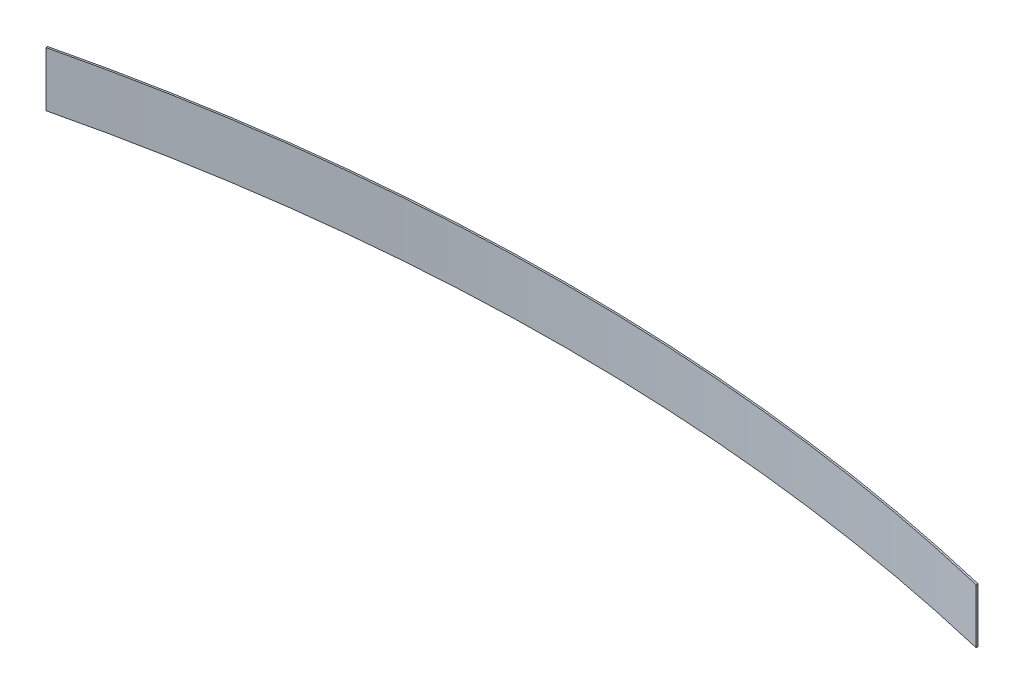
ISO-10303-21;
HEADER;
FILE_DESCRIPTION(('STEP AP214'),'2;1');
FILE_NAME('part.step','',(''),(''),'','','');
FILE_SCHEMA(('AUTOMOTIVE_DESIGN { 1 0 10303 214 1 1 1 1 }'));
ENDSEC;
DATA;
#1=APPLICATION_CONTEXT('core data for automotive mechanical design processes');
#2=APPLICATION_PROTOCOL_DEFINITION('international standard','automotive_design',2000,#1);
#3=PRODUCT_CONTEXT('',#1,'mechanical');
#4=PRODUCT('Part','Part','',(#3));
#5=PRODUCT_RELATED_PRODUCT_CATEGORY('part','',(#4));
#6=PRODUCT_DEFINITION_FORMATION('','',#4);
#7=PRODUCT_DEFINITION_CONTEXT('part definition',#1,'design');
#8=PRODUCT_DEFINITION('design','',#6,#7);
#9=PRODUCT_DEFINITION_SHAPE('','',#8);
#10=(LENGTH_UNIT() NAMED_UNIT(*) SI_UNIT(.MILLI.,.METRE.));
#11=(NAMED_UNIT(*) PLANE_ANGLE_UNIT() SI_UNIT($,.RADIAN.));
#12=(NAMED_UNIT(*) SI_UNIT($,.STERADIAN.) SOLID_ANGLE_UNIT());
#13=UNCERTAINTY_MEASURE_WITH_UNIT(LENGTH_MEASURE(1.E-05),#10,'distance_accuracy_value','');
#14=(GEOMETRIC_REPRESENTATION_CONTEXT(3) GLOBAL_UNCERTAINTY_ASSIGNED_CONTEXT((#13)) GLOBAL_UNIT_ASSIGNED_CONTEXT((#10,
#11,#12)) REPRESENTATION_CONTEXT('',''));
#15=CARTESIAN_POINT('',(0.,0.,0.));
#16=DIRECTION('',(0.,0.,1.));
#17=DIRECTION('',(1.,0.,0.));
#18=AXIS2_PLACEMENT_3D('',#15,#16,#17);
#19=CARTESIAN_POINT('',(863.6,101.6,3619.5));
#20=DIRECTION('',(0.,-1.,0.));
#21=DIRECTION('',(0.,0.,-1.));
#22=AXIS2_PLACEMENT_3D('',#19,#20,#21);
#23=CYLINDRICAL_SURFACE('',#22,3721.1);
#24=CARTESIAN_POINT('',(863.6,0.,3619.5));
#25=DIRECTION('',(0.,-1.,0.));
#26=DIRECTION('',(0.,0.,-1.));
#27=AXIS2_PLACEMENT_3D('',#24,#25,#26);
#28=CIRCLE('',#27,3721.1);
#29=CARTESIAN_POINT('',(0.,0.,0.));
#30=VERTEX_POINT('',#29);
#31=CARTESIAN_POINT('',(1727.2,0.,-2.11520995148731E-13));
#32=VERTEX_POINT('',#31);
#33=EDGE_CURVE('E80',#30,#32,#28,.T.);
#34=ORIENTED_EDGE('',*,*,#33,.T.);
#35=DIRECTION('',(0.,-1.,0.));
#36=VECTOR('',#35,1.);
#37=CARTESIAN_POINT('',(1727.2,101.6,-2.11520995148731E-13));
#38=LINE('',#37,#36);
#39=CARTESIAN_POINT('',(1727.2,101.6,-2.11520995148731E-13));
#40=VERTEX_POINT('',#39);
#41=EDGE_CURVE('E11',#40,#32,#38,.T.);
#42=ORIENTED_EDGE('',*,*,#41,.F.);
#43=CARTESIAN_POINT('',(863.6,101.6,3619.5));
#44=DIRECTION('',(0.,-1.,0.));
#45=DIRECTION('',(0.,0.,-1.));
#46=AXIS2_PLACEMENT_3D('',#43,#44,#45);
#47=CIRCLE('',#46,3721.1);
#48=CARTESIAN_POINT('',(0.,101.6,0.));
#49=VERTEX_POINT('',#48);
#50=EDGE_CURVE('E68',#49,#40,#47,.T.);
#51=ORIENTED_EDGE('',*,*,#50,.F.);
#52=DIRECTION('',(0.,-1.,0.));
#53=VECTOR('',#52,1.);
#54=CARTESIAN_POINT('',(0.,101.6,0.));
#55=LINE('',#54,#53);
#56=EDGE_CURVE('E76',#49,#30,#55,.T.);
#57=ORIENTED_EDGE('',*,*,#56,.T.);
#58=EDGE_LOOP('',(#34,#42,#51,#57));
#59=FACE_BOUND('',#58,.T.);
#60=ADVANCED_FACE('F17',(#59),#23,.F.);
#61=CARTESIAN_POINT('',(1727.93686006826,101.6,-3.08831058020554));
#62=DIRECTION('',(-0.9726962457338,0.,-0.232081911262749));
#63=DIRECTION('',(-0.232081911262749,0.,0.9726962457338));
#64=AXIS2_PLACEMENT_3D('',#61,#62,#63);
#65=PLANE('',#64);
#66=DIRECTION('',(0.232081911262749,0.,-0.9726962457338));
#67=VECTOR('',#66,1.);
#68=CARTESIAN_POINT('',(1727.93686006826,0.,-3.08831058020554));
#69=LINE('',#68,#67);
#70=CARTESIAN_POINT('',(1727.93686006826,0.,-3.08831058020509));
#71=VERTEX_POINT('',#70);
#72=EDGE_CURVE('E72',#32,#71,#69,.T.);
#73=ORIENTED_EDGE('',*,*,#72,.T.);
#74=DIRECTION('',(0.,-1.,0.));
#75=VECTOR('',#74,1.);
#76=CARTESIAN_POINT('',(1727.93686006826,101.6,-3.08831058020509));
#77=LINE('',#76,#75);
#78=CARTESIAN_POINT('',(1727.93686006826,101.6,-3.08831058020509));
#79=VERTEX_POINT('',#78);
#80=EDGE_CURVE('E25',#79,#71,#77,.T.);
#81=ORIENTED_EDGE('',*,*,#80,.F.);
#82=DIRECTION('',(0.232081911262749,0.,-0.9726962457338));
#83=VECTOR('',#82,1.);
#84=CARTESIAN_POINT('',(1727.93686006826,101.6,-3.08831058020554));
#85=LINE('',#84,#83);
#86=EDGE_CURVE('E63',#40,#79,#85,.T.);
#87=ORIENTED_EDGE('',*,*,#86,.F.);
#88=ORIENTED_EDGE('',*,*,#41,.T.);
#89=EDGE_LOOP('',(#73,#81,#87,#88));
#90=FACE_BOUND('',#89,.T.);
#91=ADVANCED_FACE('F71',(#90),#65,.F.);
#92=CARTESIAN_POINT('',(863.6,101.6,3619.5));
#93=DIRECTION('',(0.,-1.,0.));
#94=DIRECTION('',(0.,0.,-1.));
#95=AXIS2_PLACEMENT_3D('',#92,#93,#94);
#96=CYLINDRICAL_SURFACE('',#95,3724.275);
#97=CARTESIAN_POINT('',(863.6,0.,3619.5));
#98=DIRECTION('',(0.,1.,0.));
#99=DIRECTION('',(0.,0.,-1.));
#100=AXIS2_PLACEMENT_3D('',#97,#98,#99);
#101=CIRCLE('',#100,3724.275);
#102=CARTESIAN_POINT('',(-0.736860068259571,0.,-3.08831058020509));
#103=VERTEX_POINT('',#102);
#104=EDGE_CURVE('E50',#71,#103,#101,.T.);
#105=ORIENTED_EDGE('',*,*,#104,.T.);
#106=DIRECTION('',(0.,-1.,0.));
#107=VECTOR('',#106,1.);
#108=CARTESIAN_POINT('',(-0.736860068259571,101.6,-3.08831058020509));
#109=LINE('',#108,#107);
#110=CARTESIAN_POINT('',(-0.736860068259571,101.6,-3.08831058020509));
#111=VERTEX_POINT('',#110);
#112=EDGE_CURVE('E73',#111,#103,#109,.T.);
#113=ORIENTED_EDGE('',*,*,#112,.F.);
#114=CARTESIAN_POINT('',(863.6,101.6,3619.5));
#115=DIRECTION('',(0.,1.,0.));
#116=DIRECTION('',(0.,0.,-1.));
#117=AXIS2_PLACEMENT_3D('',#114,#115,#116);
#118=CIRCLE('',#117,3724.275);
#119=EDGE_CURVE('E66',#79,#111,#118,.T.);
#120=ORIENTED_EDGE('',*,*,#119,.F.);
#121=ORIENTED_EDGE('',*,*,#80,.T.);
#122=EDGE_LOOP('',(#105,#113,#120,#121));
#123=FACE_BOUND('',#122,.T.);
#124=ADVANCED_FACE('F74',(#123),#96,.T.);
#125=CARTESIAN_POINT('',(-0.736860068259571,101.6,-3.08831058020509));
#126=DIRECTION('',(0.972696245733781,0.,-0.232081911262832));
#127=DIRECTION('',(-0.232081911262832,0.,-0.972696245733781));
#128=AXIS2_PLACEMENT_3D('',#125,#126,#127);
#129=PLANE('',#128);
#130=DIRECTION('',(0.232081911262832,0.,0.972696245733781));
#131=VECTOR('',#130,1.);
#132=CARTESIAN_POINT('',(-0.736860068259571,0.,-3.08831058020509));
#133=LINE('',#132,#131);
#134=EDGE_CURVE('E56',#103,#30,#133,.T.);
#135=ORIENTED_EDGE('',*,*,#134,.T.);
#136=ORIENTED_EDGE('',*,*,#56,.F.);
#137=DIRECTION('',(0.232081911262832,0.,0.972696245733781));
#138=VECTOR('',#137,1.);
#139=CARTESIAN_POINT('',(-0.736860068259571,101.6,-3.08831058020509));
#140=LINE('',#139,#138);
#141=EDGE_CURVE('E33',#111,#49,#140,.T.);
#142=ORIENTED_EDGE('',*,*,#141,.F.);
#143=ORIENTED_EDGE('',*,*,#112,.T.);
#144=EDGE_LOOP('',(#135,#136,#142,#143));
#145=FACE_BOUND('',#144,.T.);
#146=ADVANCED_FACE('F87',(#145),#129,.F.);
#147=CARTESIAN_POINT('',(863.6,101.6,3619.5));
#148=DIRECTION('',(0.,-1.,0.));
#149=DIRECTION('',(0.,0.,-1.));
#150=AXIS2_PLACEMENT_3D('',#147,#148,#149);
#151=PLANE('',#150);
#152=ORIENTED_EDGE('',*,*,#50,.T.);
#153=ORIENTED_EDGE('',*,*,#86,.T.);
#154=ORIENTED_EDGE('',*,*,#119,.T.);
#155=ORIENTED_EDGE('',*,*,#141,.T.);
#156=EDGE_LOOP('',(#152,#153,#154,#155));
#157=FACE_BOUND('',#156,.T.);
#158=ADVANCED_FACE('F64',(#157),#151,.F.);
#159=CARTESIAN_POINT('',(863.6,0.,3619.5));
#160=DIRECTION('',(0.,-1.,0.));
#161=DIRECTION('',(0.,0.,-1.));
#162=AXIS2_PLACEMENT_3D('',#159,#160,#161);
#163=PLANE('',#162);
#164=ORIENTED_EDGE('',*,*,#33,.F.);
#165=ORIENTED_EDGE('',*,*,#134,.F.);
#166=ORIENTED_EDGE('',*,*,#104,.F.);
#167=ORIENTED_EDGE('',*,*,#72,.F.);
#168=EDGE_LOOP('',(#164,#165,#166,#167));
#169=FACE_BOUND('',#168,.T.);
#170=ADVANCED_FACE('F90',(#169),#163,.T.);
#171=CLOSED_SHELL('',(#60,#91,#124,#146,#158,#170));
#172=MANIFOLD_SOLID_BREP('B1',#171);
#173=ADVANCED_BREP_SHAPE_REPRESENTATION('',(#18,#172),#14);
#174=SHAPE_DEFINITION_REPRESENTATION(#9,#173);
ENDSEC;
END-ISO-10303-21;
